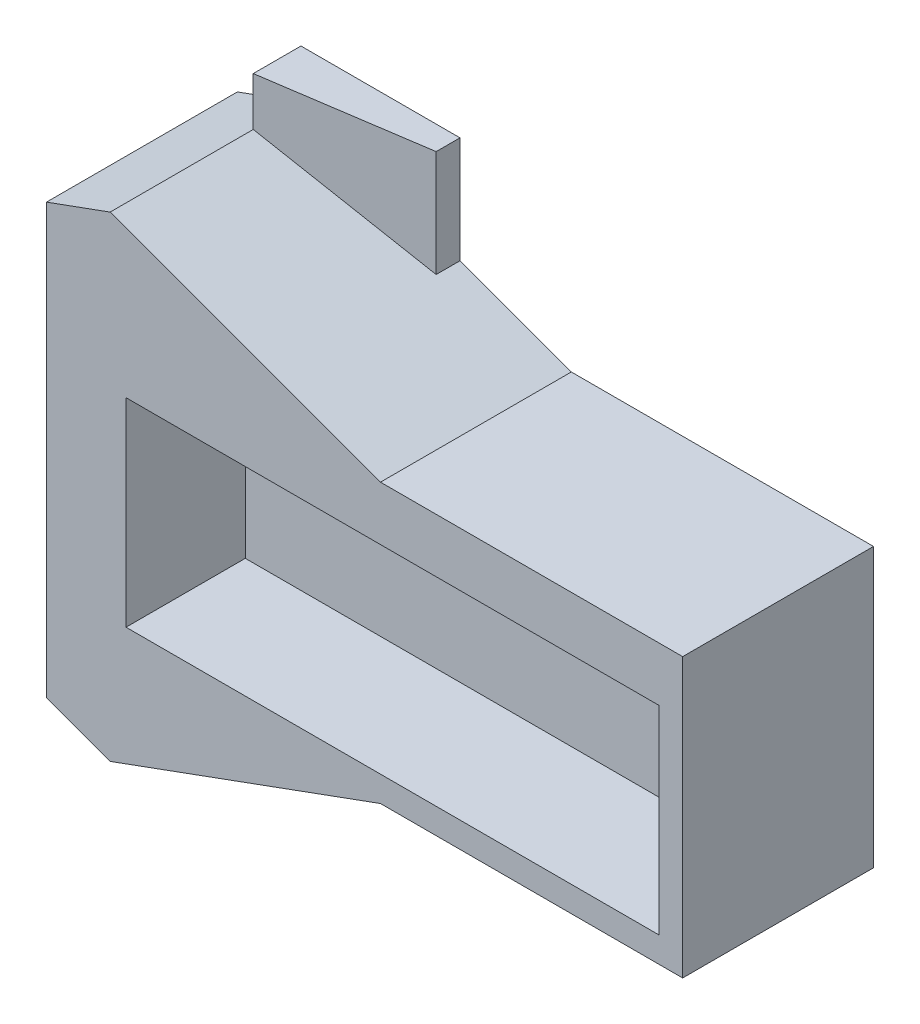
ISO-10303-21;
HEADER;
FILE_DESCRIPTION(('STEP AP214'),'2;1');
FILE_NAME('part.step','',(''),(''),'','','');
FILE_SCHEMA(('AUTOMOTIVE_DESIGN { 1 0 10303 214 1 1 1 1 }'));
ENDSEC;
DATA;
#1=APPLICATION_CONTEXT('core data for automotive mechanical design processes');
#2=APPLICATION_PROTOCOL_DEFINITION('international standard','automotive_design',2000,#1);
#3=PRODUCT_CONTEXT('',#1,'mechanical');
#4=PRODUCT('Part','Part','',(#3));
#5=PRODUCT_RELATED_PRODUCT_CATEGORY('part','',(#4));
#6=PRODUCT_DEFINITION_FORMATION('','',#4);
#7=PRODUCT_DEFINITION_CONTEXT('part definition',#1,'design');
#8=PRODUCT_DEFINITION('design','',#6,#7);
#9=PRODUCT_DEFINITION_SHAPE('','',#8);
#10=(LENGTH_UNIT() NAMED_UNIT(*) SI_UNIT(.MILLI.,.METRE.));
#11=(NAMED_UNIT(*) PLANE_ANGLE_UNIT() SI_UNIT($,.RADIAN.));
#12=(NAMED_UNIT(*) SI_UNIT($,.STERADIAN.) SOLID_ANGLE_UNIT());
#13=UNCERTAINTY_MEASURE_WITH_UNIT(LENGTH_MEASURE(1.E-05),#10,'distance_accuracy_value','');
#14=(GEOMETRIC_REPRESENTATION_CONTEXT(3) GLOBAL_UNCERTAINTY_ASSIGNED_CONTEXT((#13)) GLOBAL_UNIT_ASSIGNED_CONTEXT((#10,
#11,#12)) REPRESENTATION_CONTEXT('',''));
#15=CARTESIAN_POINT('',(0.,0.,0.));
#16=DIRECTION('',(0.,0.,1.));
#17=DIRECTION('',(1.,0.,0.));
#18=AXIS2_PLACEMENT_3D('',#15,#16,#17);
#19=CARTESIAN_POINT('',(8.,-29.9117618741296,24.));
#20=DIRECTION('',(-0.342917141847565,0.939365655017841,0.));
#21=DIRECTION('',(-0.939365655017841,-0.342917141847565,0.));
#22=AXIS2_PLACEMENT_3D('',#19,#20,#21);
#23=PLANE('',#22);
#24=DIRECTION('',(-0.930177088777126,-0.339562839019788,0.139526563316569));
#25=VECTOR('',#24,1.);
#26=CARTESIAN_POINT('',(5.6638805754881,-30.7645665213817,6.35041791367679));
#27=LINE('',#26,#25);
#28=CARTESIAN_POINT('',(28.,-22.6107254775828,3.));
#29=VERTEX_POINT('',#28);
#30=CARTESIAN_POINT('',(8.,-29.9117618741296,6.));
#31=VERTEX_POINT('',#30);
#32=EDGE_CURVE('E289',#29,#31,#27,.T.);
#33=ORIENTED_EDGE('',*,*,#32,.F.);
#34=DIRECTION('',(0.,0.,1.));
#35=VECTOR('',#34,1.);
#36=CARTESIAN_POINT('',(28.,-22.6107254775828,24.));
#37=LINE('',#36,#35);
#38=CARTESIAN_POINT('',(28.,-22.6107254775828,0.));
#39=VERTEX_POINT('',#38);
#40=EDGE_CURVE('E279',#39,#29,#37,.T.);
#41=ORIENTED_EDGE('',*,*,#40,.F.);
#42=DIRECTION('',(0.939365655017841,0.342917141847565,0.));
#43=VECTOR('',#42,1.);
#44=CARTESIAN_POINT('',(8.,-29.9117618741296,0.));
#45=LINE('',#44,#43);
#46=CARTESIAN_POINT('',(42.,-17.5,0.));
#47=VERTEX_POINT('',#46);
#48=EDGE_CURVE('E330',#39,#47,#45,.T.);
#49=ORIENTED_EDGE('',*,*,#48,.T.);
#50=DIRECTION('',(0.,0.,-1.));
#51=VECTOR('',#50,1.);
#52=CARTESIAN_POINT('',(42.,-17.5,24.));
#53=LINE('',#52,#51);
#54=CARTESIAN_POINT('',(42.,-17.5,24.));
#55=VERTEX_POINT('',#54);
#56=EDGE_CURVE('E359',#55,#47,#53,.T.);
#57=ORIENTED_EDGE('',*,*,#56,.F.);
#58=DIRECTION('',(0.939365655017841,0.342917141847565,0.));
#59=VECTOR('',#58,1.);
#60=CARTESIAN_POINT('',(8.,-29.9117618741296,24.));
#61=LINE('',#60,#59);
#62=CARTESIAN_POINT('',(8.,-29.9117618741296,24.));
#63=VERTEX_POINT('',#62);
#64=EDGE_CURVE('E305',#63,#55,#61,.T.);
#65=ORIENTED_EDGE('',*,*,#64,.F.);
#66=DIRECTION('',(0.,0.,-1.));
#67=VECTOR('',#66,1.);
#68=CARTESIAN_POINT('',(8.,-29.9117618741296,24.));
#69=LINE('',#68,#67);
#70=EDGE_CURVE('E363',#63,#31,#69,.T.);
#71=ORIENTED_EDGE('',*,*,#70,.T.);
#72=EDGE_LOOP('',(#33,#41,#49,#57,#65,#71));
#73=FACE_BOUND('',#72,.T.);
#74=ADVANCED_FACE('F43',(#73),#23,.F.);
#75=CARTESIAN_POINT('',(8.,29.9117618741296,24.));
#76=DIRECTION('',(-0.342917141847565,-0.939365655017841,0.));
#77=DIRECTION('',(0.939365655017841,-0.342917141847565,0.));
#78=AXIS2_PLACEMENT_3D('',#75,#76,#77);
#79=PLANE('',#78);
#80=DIRECTION('',(0.930177088777126,-0.339562839019788,-0.139526563316569));
#81=VECTOR('',#80,1.);
#82=CARTESIAN_POINT('',(5.6638805754881,30.7645665213817,6.35041791367679));
#83=LINE('',#82,#81);
#84=CARTESIAN_POINT('',(8.,29.9117618741296,6.));
#85=VERTEX_POINT('',#84);
#86=CARTESIAN_POINT('',(28.,22.6107254775828,3.));
#87=VERTEX_POINT('',#86);
#88=EDGE_CURVE('E11',#85,#87,#83,.T.);
#89=ORIENTED_EDGE('',*,*,#88,.F.);
#90=DIRECTION('',(0.,0.,-1.));
#91=VECTOR('',#90,1.);
#92=CARTESIAN_POINT('',(8.,29.9117618741296,24.));
#93=LINE('',#92,#91);
#94=CARTESIAN_POINT('',(8.,29.9117618741296,24.));
#95=VERTEX_POINT('',#94);
#96=EDGE_CURVE('E320',#95,#85,#93,.T.);
#97=ORIENTED_EDGE('',*,*,#96,.F.);
#98=DIRECTION('',(-0.939365655017841,0.342917141847565,0.));
#99=VECTOR('',#98,1.);
#100=CARTESIAN_POINT('',(8.,29.9117618741296,24.));
#101=LINE('',#100,#99);
#102=CARTESIAN_POINT('',(42.,17.5,24.));
#103=VERTEX_POINT('',#102);
#104=EDGE_CURVE('E317',#103,#95,#101,.T.);
#105=ORIENTED_EDGE('',*,*,#104,.F.);
#106=DIRECTION('',(0.,0.,-1.));
#107=VECTOR('',#106,1.);
#108=CARTESIAN_POINT('',(42.,17.5,24.));
#109=LINE('',#108,#107);
#110=CARTESIAN_POINT('',(42.,17.5,0.));
#111=VERTEX_POINT('',#110);
#112=EDGE_CURVE('E347',#103,#111,#109,.T.);
#113=ORIENTED_EDGE('',*,*,#112,.T.);
#114=DIRECTION('',(-0.939365655017841,0.342917141847565,0.));
#115=VECTOR('',#114,1.);
#116=CARTESIAN_POINT('',(8.,29.9117618741296,0.));
#117=LINE('',#116,#115);
#118=CARTESIAN_POINT('',(28.,22.6107254775828,0.));
#119=VERTEX_POINT('',#118);
#120=EDGE_CURVE('E299',#111,#119,#117,.T.);
#121=ORIENTED_EDGE('',*,*,#120,.T.);
#122=DIRECTION('',(0.,0.,-1.));
#123=VECTOR('',#122,1.);
#124=CARTESIAN_POINT('',(28.,22.6107254775828,24.));
#125=LINE('',#124,#123);
#126=EDGE_CURVE('E275',#87,#119,#125,.T.);
#127=ORIENTED_EDGE('',*,*,#126,.F.);
#128=EDGE_LOOP('',(#89,#97,#105,#113,#121,#127));
#129=FACE_BOUND('',#128,.T.);
#130=ADVANCED_FACE('F398',(#129),#79,.F.);
#131=CARTESIAN_POINT('',(0.,27.,24.));
#132=DIRECTION('',(0.342020143325666,-0.939692620785909,0.));
#133=DIRECTION('',(0.93969262078591,0.342020143325666,0.));
#134=AXIS2_PLACEMENT_3D('',#131,#132,#133);
#135=PLANE('',#134);
#136=DIRECTION('',(-0.93969262078591,-0.342020143325666,0.));
#137=VECTOR('',#136,1.);
#138=CARTESIAN_POINT('',(0.,27.,0.));
#139=LINE('',#138,#137);
#140=CARTESIAN_POINT('',(8.,29.9117618741296,0.));
#141=VERTEX_POINT('',#140);
#142=CARTESIAN_POINT('',(0.,27.,0.));
#143=VERTEX_POINT('',#142);
#144=EDGE_CURVE('E293',#141,#143,#139,.T.);
#145=ORIENTED_EDGE('',*,*,#144,.T.);
#146=DIRECTION('',(0.,0.,-1.));
#147=VECTOR('',#146,1.);
#148=CARTESIAN_POINT('',(0.,27.,24.));
#149=LINE('',#148,#147);
#150=CARTESIAN_POINT('',(0.,27.,24.));
#151=VERTEX_POINT('',#150);
#152=EDGE_CURVE('E52',#151,#143,#149,.T.);
#153=ORIENTED_EDGE('',*,*,#152,.F.);
#154=DIRECTION('',(-0.93969262078591,-0.342020143325666,0.));
#155=VECTOR('',#154,1.);
#156=CARTESIAN_POINT('',(0.,27.,24.));
#157=LINE('',#156,#155);
#158=EDGE_CURVE('E294',#95,#151,#157,.T.);
#159=ORIENTED_EDGE('',*,*,#158,.F.);
#160=ORIENTED_EDGE('',*,*,#96,.T.);
#161=DIRECTION('',(0.,0.,1.));
#162=VECTOR('',#161,1.);
#163=CARTESIAN_POINT('',(8.,29.9117618741296,24.));
#164=LINE('',#163,#162);
#165=EDGE_CURVE('E283',#141,#85,#164,.T.);
#166=ORIENTED_EDGE('',*,*,#165,.F.);
#167=EDGE_LOOP('',(#145,#153,#159,#160,#166));
#168=FACE_BOUND('',#167,.T.);
#169=ADVANCED_FACE('F45',(#168),#135,.F.);
#170=CARTESIAN_POINT('',(0.,-27.,24.));
#171=DIRECTION('',(1.,0.,0.));
#172=DIRECTION('',(0.,0.,-1.));
#173=AXIS2_PLACEMENT_3D('',#170,#171,#172);
#174=PLANE('',#173);
#175=DIRECTION('',(0.,-1.,0.));
#176=VECTOR('',#175,1.);
#177=CARTESIAN_POINT('',(0.,-27.,0.));
#178=LINE('',#177,#176);
#179=CARTESIAN_POINT('',(0.,-27.,0.));
#180=VERTEX_POINT('',#179);
#181=EDGE_CURVE('E324',#143,#180,#178,.T.);
#182=ORIENTED_EDGE('',*,*,#181,.T.);
#183=DIRECTION('',(0.,0.,-1.));
#184=VECTOR('',#183,1.);
#185=CARTESIAN_POINT('',(0.,-27.,24.));
#186=LINE('',#185,#184);
#187=CARTESIAN_POINT('',(0.,-27.,24.));
#188=VERTEX_POINT('',#187);
#189=EDGE_CURVE('E366',#188,#180,#186,.T.);
#190=ORIENTED_EDGE('',*,*,#189,.F.);
#191=DIRECTION('',(0.,-1.,0.));
#192=VECTOR('',#191,1.);
#193=CARTESIAN_POINT('',(0.,-27.,24.));
#194=LINE('',#193,#192);
#195=EDGE_CURVE('E298',#151,#188,#194,.T.);
#196=ORIENTED_EDGE('',*,*,#195,.F.);
#197=ORIENTED_EDGE('',*,*,#152,.T.);
#198=EDGE_LOOP('',(#182,#190,#196,#197));
#199=FACE_BOUND('',#198,.T.);
#200=ADVANCED_FACE('F373',(#199),#174,.F.);
#201=CARTESIAN_POINT('',(0.,-27.,24.));
#202=DIRECTION('',(0.342020143325666,0.939692620785909,0.));
#203=DIRECTION('',(-0.93969262078591,0.342020143325666,0.));
#204=AXIS2_PLACEMENT_3D('',#201,#202,#203);
#205=PLANE('',#204);
#206=DIRECTION('',(0.93969262078591,-0.342020143325666,0.));
#207=VECTOR('',#206,1.);
#208=CARTESIAN_POINT('',(0.,-27.,0.));
#209=LINE('',#208,#207);
#210=CARTESIAN_POINT('',(8.,-29.9117618741296,0.));
#211=VERTEX_POINT('',#210);
#212=EDGE_CURVE('E327',#180,#211,#209,.T.);
#213=ORIENTED_EDGE('',*,*,#212,.T.);
#214=DIRECTION('',(0.,0.,-1.));
#215=VECTOR('',#214,1.);
#216=CARTESIAN_POINT('',(8.,-29.9117618741296,24.));
#217=LINE('',#216,#215);
#218=EDGE_CURVE('E67',#31,#211,#217,.T.);
#219=ORIENTED_EDGE('',*,*,#218,.F.);
#220=ORIENTED_EDGE('',*,*,#70,.F.);
#221=DIRECTION('',(0.93969262078591,-0.342020143325666,0.));
#222=VECTOR('',#221,1.);
#223=CARTESIAN_POINT('',(0.,-27.,24.));
#224=LINE('',#223,#222);
#225=EDGE_CURVE('E302',#188,#63,#224,.T.);
#226=ORIENTED_EDGE('',*,*,#225,.F.);
#227=ORIENTED_EDGE('',*,*,#189,.T.);
#228=EDGE_LOOP('',(#213,#219,#220,#226,#227));
#229=FACE_BOUND('',#228,.T.);
#230=ADVANCED_FACE('F426',(#229),#205,.F.);
#231=CARTESIAN_POINT('',(42.,-17.5,24.));
#232=DIRECTION('',(0.,1.,0.));
#233=DIRECTION('',(0.,0.,1.));
#234=AXIS2_PLACEMENT_3D('',#231,#232,#233);
#235=PLANE('',#234);
#236=DIRECTION('',(1.,0.,0.));
#237=VECTOR('',#236,1.);
#238=CARTESIAN_POINT('',(42.,-17.5,0.));
#239=LINE('',#238,#237);
#240=CARTESIAN_POINT('',(80.,-17.5,0.));
#241=VERTEX_POINT('',#240);
#242=EDGE_CURVE('E333',#47,#241,#239,.T.);
#243=ORIENTED_EDGE('',*,*,#242,.T.);
#244=DIRECTION('',(0.,0.,-1.));
#245=VECTOR('',#244,1.);
#246=CARTESIAN_POINT('',(80.,-17.5,24.));
#247=LINE('',#246,#245);
#248=CARTESIAN_POINT('',(80.,-17.5,24.));
#249=VERTEX_POINT('',#248);
#250=EDGE_CURVE('E355',#249,#241,#247,.T.);
#251=ORIENTED_EDGE('',*,*,#250,.F.);
#252=DIRECTION('',(1.,0.,0.));
#253=VECTOR('',#252,1.);
#254=CARTESIAN_POINT('',(42.,-17.5,24.));
#255=LINE('',#254,#253);
#256=EDGE_CURVE('E308',#55,#249,#255,.T.);
#257=ORIENTED_EDGE('',*,*,#256,.F.);
#258=ORIENTED_EDGE('',*,*,#56,.T.);
#259=EDGE_LOOP('',(#243,#251,#257,#258));
#260=FACE_BOUND('',#259,.T.);
#261=ADVANCED_FACE('F424',(#260),#235,.F.);
#262=CARTESIAN_POINT('',(80.,17.5,24.));
#263=DIRECTION('',(-1.,0.,0.));
#264=DIRECTION('',(0.,0.,1.));
#265=AXIS2_PLACEMENT_3D('',#262,#263,#264);
#266=PLANE('',#265);
#267=DIRECTION('',(0.,1.,0.));
#268=VECTOR('',#267,1.);
#269=CARTESIAN_POINT('',(80.,17.5,0.));
#270=LINE('',#269,#268);
#271=CARTESIAN_POINT('',(80.,17.5,0.));
#272=VERTEX_POINT('',#271);
#273=EDGE_CURVE('E336',#241,#272,#270,.T.);
#274=ORIENTED_EDGE('',*,*,#273,.T.);
#275=DIRECTION('',(0.,0.,-1.));
#276=VECTOR('',#275,1.);
#277=CARTESIAN_POINT('',(80.,17.5,24.));
#278=LINE('',#277,#276);
#279=CARTESIAN_POINT('',(80.,17.5,24.));
#280=VERTEX_POINT('',#279);
#281=EDGE_CURVE('E351',#280,#272,#278,.T.);
#282=ORIENTED_EDGE('',*,*,#281,.F.);
#283=DIRECTION('',(0.,1.,0.));
#284=VECTOR('',#283,1.);
#285=CARTESIAN_POINT('',(80.,17.5,24.));
#286=LINE('',#285,#284);
#287=EDGE_CURVE('E311',#249,#280,#286,.T.);
#288=ORIENTED_EDGE('',*,*,#287,.F.);
#289=ORIENTED_EDGE('',*,*,#250,.T.);
#290=EDGE_LOOP('',(#274,#282,#288,#289));
#291=FACE_BOUND('',#290,.T.);
#292=ADVANCED_FACE('F456',(#291),#266,.F.);
#293=CARTESIAN_POINT('',(42.,17.5,24.));
#294=DIRECTION('',(0.,-1.,0.));
#295=DIRECTION('',(0.,0.,-1.));
#296=AXIS2_PLACEMENT_3D('',#293,#294,#295);
#297=PLANE('',#296);
#298=DIRECTION('',(-1.,0.,0.));
#299=VECTOR('',#298,1.);
#300=CARTESIAN_POINT('',(42.,17.5,0.));
#301=LINE('',#300,#299);
#302=EDGE_CURVE('E339',#272,#111,#301,.T.);
#303=ORIENTED_EDGE('',*,*,#302,.T.);
#304=ORIENTED_EDGE('',*,*,#112,.F.);
#305=DIRECTION('',(-1.,0.,0.));
#306=VECTOR('',#305,1.);
#307=CARTESIAN_POINT('',(42.,17.5,24.));
#308=LINE('',#307,#306);
#309=EDGE_CURVE('E314',#280,#103,#308,.T.);
#310=ORIENTED_EDGE('',*,*,#309,.F.);
#311=ORIENTED_EDGE('',*,*,#281,.T.);
#312=EDGE_LOOP('',(#303,#304,#310,#311));
#313=FACE_BOUND('',#312,.T.);
#314=ADVANCED_FACE('F450',(#313),#297,.F.);
#315=CARTESIAN_POINT('',(0.,0.,24.));
#316=DIRECTION('',(0.,0.,-1.));
#317=DIRECTION('',(-1.,0.,0.));
#318=AXIS2_PLACEMENT_3D('',#315,#316,#317);
#319=PLANE('',#318);
#320=DIRECTION('',(-1.,0.,0.));
#321=VECTOR('',#320,1.);
#322=CARTESIAN_POINT('',(9.99999999999999,10.7021672824616,24.));
#323=LINE('',#322,#321);
#324=CARTESIAN_POINT('',(77.,10.7021672824616,24.));
#325=VERTEX_POINT('',#324);
#326=CARTESIAN_POINT('',(9.99999999999999,10.7021672824616,24.));
#327=VERTEX_POINT('',#326);
#328=EDGE_CURVE('E212',#325,#327,#323,.T.);
#329=ORIENTED_EDGE('',*,*,#328,.F.);
#330=DIRECTION('',(0.,1.,0.));
#331=VECTOR('',#330,1.);
#332=CARTESIAN_POINT('',(77.,-14.2978327175384,24.));
#333=LINE('',#332,#331);
#334=CARTESIAN_POINT('',(77.,-14.2978327175384,24.));
#335=VERTEX_POINT('',#334);
#336=EDGE_CURVE('E59',#335,#325,#333,.T.);
#337=ORIENTED_EDGE('',*,*,#336,.F.);
#338=DIRECTION('',(1.,0.,0.));
#339=VECTOR('',#338,1.);
#340=CARTESIAN_POINT('',(9.99999999999999,-14.2978327175384,24.));
#341=LINE('',#340,#339);
#342=CARTESIAN_POINT('',(9.99999999999999,-14.2978327175384,24.));
#343=VERTEX_POINT('',#342);
#344=EDGE_CURVE('E199',#343,#335,#341,.T.);
#345=ORIENTED_EDGE('',*,*,#344,.F.);
#346=DIRECTION('',(0.,-1.,0.));
#347=VECTOR('',#346,1.);
#348=CARTESIAN_POINT('',(9.99999999999999,-14.2978327175384,24.));
#349=LINE('',#348,#347);
#350=EDGE_CURVE('E203',#327,#343,#349,.T.);
#351=ORIENTED_EDGE('',*,*,#350,.F.);
#352=EDGE_LOOP('',(#329,#337,#345,#351));
#353=FACE_BOUND('',#352,.T.);
#354=ORIENTED_EDGE('',*,*,#158,.T.);
#355=ORIENTED_EDGE('',*,*,#195,.T.);
#356=ORIENTED_EDGE('',*,*,#225,.T.);
#357=ORIENTED_EDGE('',*,*,#64,.T.);
#358=ORIENTED_EDGE('',*,*,#256,.T.);
#359=ORIENTED_EDGE('',*,*,#287,.T.);
#360=ORIENTED_EDGE('',*,*,#309,.T.);
#361=ORIENTED_EDGE('',*,*,#104,.T.);
#362=EDGE_LOOP('',(#354,#355,#356,#357,#358,#359,#360,#361));
#363=FACE_BOUND('',#362,.T.);
#364=ADVANCED_FACE('F455',(#353,#363),#319,.F.);
#365=CARTESIAN_POINT('',(0.,0.,0.));
#366=DIRECTION('',(0.,0.,-1.));
#367=DIRECTION('',(-1.,0.,0.));
#368=AXIS2_PLACEMENT_3D('',#365,#366,#367);
#369=PLANE('',#368);
#370=ORIENTED_EDGE('',*,*,#48,.F.);
#371=DIRECTION('',(0.,-1.,0.));
#372=VECTOR('',#371,1.);
#373=CARTESIAN_POINT('',(28.,36.,0.));
#374=LINE('',#373,#372);
#375=CARTESIAN_POINT('',(28.,-36.,0.));
#376=VERTEX_POINT('',#375);
#377=EDGE_CURVE('E241',#39,#376,#374,.T.);
#378=ORIENTED_EDGE('',*,*,#377,.T.);
#379=DIRECTION('',(-1.,0.,0.));
#380=VECTOR('',#379,1.);
#381=CARTESIAN_POINT('',(28.,-36.,0.));
#382=LINE('',#381,#380);
#383=CARTESIAN_POINT('',(8.,-36.,0.));
#384=VERTEX_POINT('',#383);
#385=EDGE_CURVE('E221',#376,#384,#382,.T.);
#386=ORIENTED_EDGE('',*,*,#385,.T.);
#387=DIRECTION('',(0.,-1.,0.));
#388=VECTOR('',#387,1.);
#389=CARTESIAN_POINT('',(8.,36.,0.));
#390=LINE('',#389,#388);
#391=EDGE_CURVE('E270',#211,#384,#390,.T.);
#392=ORIENTED_EDGE('',*,*,#391,.F.);
#393=ORIENTED_EDGE('',*,*,#212,.F.);
#394=ORIENTED_EDGE('',*,*,#181,.F.);
#395=ORIENTED_EDGE('',*,*,#144,.F.);
#396=CARTESIAN_POINT('',(8.,36.,0.));
#397=VERTEX_POINT('',#396);
#398=EDGE_CURVE('E271',#397,#141,#390,.T.);
#399=ORIENTED_EDGE('',*,*,#398,.F.);
#400=DIRECTION('',(-1.,0.,0.));
#401=VECTOR('',#400,1.);
#402=CARTESIAN_POINT('',(28.,36.,0.));
#403=LINE('',#402,#401);
#404=CARTESIAN_POINT('',(28.,36.,0.));
#405=VERTEX_POINT('',#404);
#406=EDGE_CURVE('E227',#405,#397,#403,.T.);
#407=ORIENTED_EDGE('',*,*,#406,.F.);
#408=EDGE_CURVE('E256',#405,#119,#374,.T.);
#409=ORIENTED_EDGE('',*,*,#408,.T.);
#410=ORIENTED_EDGE('',*,*,#120,.F.);
#411=ORIENTED_EDGE('',*,*,#302,.F.);
#412=ORIENTED_EDGE('',*,*,#273,.F.);
#413=ORIENTED_EDGE('',*,*,#242,.F.);
#414=EDGE_LOOP('',(#370,#378,#386,#392,#393,#394,#395,#399,#407,#409,#410,#411,#412,#413));
#415=FACE_BOUND('',#414,.T.);
#416=ADVANCED_FACE('F381',(#415),#369,.T.);
#417=CARTESIAN_POINT('',(0.,36.,0.));
#418=DIRECTION('',(0.,1.,0.));
#419=DIRECTION('',(0.,0.,1.));
#420=AXIS2_PLACEMENT_3D('',#417,#418,#419);
#421=PLANE('',#420);
#422=ORIENTED_EDGE('',*,*,#406,.T.);
#423=DIRECTION('',(0.,0.,1.));
#424=VECTOR('',#423,1.);
#425=CARTESIAN_POINT('',(8.,36.,0.));
#426=LINE('',#425,#424);
#427=CARTESIAN_POINT('',(8.,36.,6.));
#428=VERTEX_POINT('',#427);
#429=EDGE_CURVE('E231',#397,#428,#426,.T.);
#430=ORIENTED_EDGE('',*,*,#429,.T.);
#431=DIRECTION('',(0.988936352868298,0.,-0.148340452930245));
#432=VECTOR('',#431,1.);
#433=CARTESIAN_POINT('',(8.,36.,6.));
#434=LINE('',#433,#432);
#435=CARTESIAN_POINT('',(28.,36.,3.));
#436=VERTEX_POINT('',#435);
#437=EDGE_CURVE('E235',#428,#436,#434,.T.);
#438=ORIENTED_EDGE('',*,*,#437,.T.);
#439=DIRECTION('',(0.,0.,-1.));
#440=VECTOR('',#439,1.);
#441=CARTESIAN_POINT('',(28.,36.,3.));
#442=LINE('',#441,#440);
#443=EDGE_CURVE('E238',#436,#405,#442,.T.);
#444=ORIENTED_EDGE('',*,*,#443,.T.);
#445=EDGE_LOOP('',(#422,#430,#438,#444));
#446=FACE_BOUND('',#445,.T.);
#447=ADVANCED_FACE('F389',(#446),#421,.T.);
#448=CARTESIAN_POINT('',(28.,36.,3.));
#449=DIRECTION('',(-1.,0.,0.));
#450=DIRECTION('',(0.,0.,1.));
#451=AXIS2_PLACEMENT_3D('',#448,#449,#450);
#452=PLANE('',#451);
#453=DIRECTION('',(0.,-1.,0.));
#454=VECTOR('',#453,1.);
#455=CARTESIAN_POINT('',(28.,36.,3.));
#456=LINE('',#455,#454);
#457=EDGE_CURVE('E261',#436,#87,#456,.T.);
#458=ORIENTED_EDGE('',*,*,#457,.T.);
#459=ORIENTED_EDGE('',*,*,#126,.T.);
#460=ORIENTED_EDGE('',*,*,#408,.F.);
#461=ORIENTED_EDGE('',*,*,#443,.F.);
#462=EDGE_LOOP('',(#458,#459,#460,#461));
#463=FACE_BOUND('',#462,.T.);
#464=ADVANCED_FACE('F395',(#463),#452,.F.);
#465=CARTESIAN_POINT('',(8.,36.,6.));
#466=DIRECTION('',(-0.148340452930245,0.,-0.988936352868297));
#467=DIRECTION('',(-0.988936352868298,0.,0.148340452930245));
#468=AXIS2_PLACEMENT_3D('',#465,#466,#467);
#469=PLANE('',#468);
#470=DIRECTION('',(0.,-1.,0.));
#471=VECTOR('',#470,1.);
#472=CARTESIAN_POINT('',(8.,36.,6.));
#473=LINE('',#472,#471);
#474=EDGE_CURVE('E266',#428,#85,#473,.T.);
#475=ORIENTED_EDGE('',*,*,#474,.T.);
#476=ORIENTED_EDGE('',*,*,#88,.T.);
#477=ORIENTED_EDGE('',*,*,#457,.F.);
#478=ORIENTED_EDGE('',*,*,#437,.F.);
#479=EDGE_LOOP('',(#475,#476,#477,#478));
#480=FACE_BOUND('',#479,.T.);
#481=ADVANCED_FACE('F401',(#480),#469,.F.);
#482=CARTESIAN_POINT('',(8.,36.,0.));
#483=DIRECTION('',(1.,0.,0.));
#484=DIRECTION('',(0.,0.,-1.));
#485=AXIS2_PLACEMENT_3D('',#482,#483,#484);
#486=PLANE('',#485);
#487=ORIENTED_EDGE('',*,*,#398,.T.);
#488=ORIENTED_EDGE('',*,*,#165,.T.);
#489=ORIENTED_EDGE('',*,*,#474,.F.);
#490=ORIENTED_EDGE('',*,*,#429,.F.);
#491=EDGE_LOOP('',(#487,#488,#489,#490));
#492=FACE_BOUND('',#491,.T.);
#493=ADVANCED_FACE('F385',(#492),#486,.F.);
#494=CARTESIAN_POINT('',(28.,-36.,3.));
#495=VERTEX_POINT('',#494);
#496=EDGE_CURVE('E260',#29,#495,#456,.T.);
#497=ORIENTED_EDGE('',*,*,#496,.F.);
#498=ORIENTED_EDGE('',*,*,#32,.T.);
#499=CARTESIAN_POINT('',(8.,-36.,6.));
#500=VERTEX_POINT('',#499);
#501=EDGE_CURVE('E265',#31,#500,#473,.T.);
#502=ORIENTED_EDGE('',*,*,#501,.T.);
#503=DIRECTION('',(0.988936352868298,0.,-0.148340452930245));
#504=VECTOR('',#503,1.);
#505=CARTESIAN_POINT('',(8.,-36.,6.));
#506=LINE('',#505,#504);
#507=EDGE_CURVE('E249',#500,#495,#506,.T.);
#508=ORIENTED_EDGE('',*,*,#507,.T.);
#509=EDGE_LOOP('',(#497,#498,#502,#508));
#510=FACE_BOUND('',#509,.T.);
#511=ADVANCED_FACE('F404',(#510),#469,.F.);
#512=ORIENTED_EDGE('',*,*,#501,.F.);
#513=ORIENTED_EDGE('',*,*,#218,.T.);
#514=ORIENTED_EDGE('',*,*,#391,.T.);
#515=DIRECTION('',(0.,0.,1.));
#516=VECTOR('',#515,1.);
#517=CARTESIAN_POINT('',(8.,-36.,0.));
#518=LINE('',#517,#516);
#519=EDGE_CURVE('E245',#384,#500,#518,.T.);
#520=ORIENTED_EDGE('',*,*,#519,.T.);
#521=EDGE_LOOP('',(#512,#513,#514,#520));
#522=FACE_BOUND('',#521,.T.);
#523=ADVANCED_FACE('F410',(#522),#486,.F.);
#524=ORIENTED_EDGE('',*,*,#377,.F.);
#525=ORIENTED_EDGE('',*,*,#40,.T.);
#526=ORIENTED_EDGE('',*,*,#496,.T.);
#527=DIRECTION('',(0.,0.,-1.));
#528=VECTOR('',#527,1.);
#529=CARTESIAN_POINT('',(28.,-36.,3.));
#530=LINE('',#529,#528);
#531=EDGE_CURVE('E232',#495,#376,#530,.T.);
#532=ORIENTED_EDGE('',*,*,#531,.T.);
#533=EDGE_LOOP('',(#524,#525,#526,#532));
#534=FACE_BOUND('',#533,.T.);
#535=ADVANCED_FACE('F412',(#534),#452,.F.);
#536=CARTESIAN_POINT('',(0.,-36.,0.));
#537=DIRECTION('',(0.,1.,0.));
#538=DIRECTION('',(0.,0.,1.));
#539=AXIS2_PLACEMENT_3D('',#536,#537,#538);
#540=PLANE('',#539);
#541=ORIENTED_EDGE('',*,*,#385,.F.);
#542=ORIENTED_EDGE('',*,*,#531,.F.);
#543=ORIENTED_EDGE('',*,*,#507,.F.);
#544=ORIENTED_EDGE('',*,*,#519,.F.);
#545=EDGE_LOOP('',(#541,#542,#543,#544));
#546=FACE_BOUND('',#545,.T.);
#547=ADVANCED_FACE('F555',(#546),#540,.F.);
#548=CARTESIAN_POINT('',(77.,-14.2978327175384,9.));
#549=DIRECTION('',(1.,0.,0.));
#550=DIRECTION('',(0.,0.,-1.));
#551=AXIS2_PLACEMENT_3D('',#548,#549,#550);
#552=PLANE('',#551);
#553=ORIENTED_EDGE('',*,*,#336,.T.);
#554=DIRECTION('',(0.,0.,1.));
#555=VECTOR('',#554,1.);
#556=CARTESIAN_POINT('',(77.,10.7021672824616,9.));
#557=LINE('',#556,#555);
#558=CARTESIAN_POINT('',(77.,10.7021672824616,9.));
#559=VERTEX_POINT('',#558);
#560=EDGE_CURVE('E174',#559,#325,#557,.T.);
#561=ORIENTED_EDGE('',*,*,#560,.F.);
#562=DIRECTION('',(0.,1.,0.));
#563=VECTOR('',#562,1.);
#564=CARTESIAN_POINT('',(77.,-14.2978327175384,9.));
#565=LINE('',#564,#563);
#566=CARTESIAN_POINT('',(77.,-14.2978327175384,9.));
#567=VERTEX_POINT('',#566);
#568=EDGE_CURVE('E178',#567,#559,#565,.T.);
#569=ORIENTED_EDGE('',*,*,#568,.F.);
#570=DIRECTION('',(0.,0.,1.));
#571=VECTOR('',#570,1.);
#572=CARTESIAN_POINT('',(77.,-14.2978327175384,9.));
#573=LINE('',#572,#571);
#574=EDGE_CURVE('E218',#567,#335,#573,.T.);
#575=ORIENTED_EDGE('',*,*,#574,.T.);
#576=EDGE_LOOP('',(#553,#561,#569,#575));
#577=FACE_BOUND('',#576,.T.);
#578=ADVANCED_FACE('F176',(#577),#552,.F.);
#579=CARTESIAN_POINT('',(9.99999999999999,-14.2978327175384,9.));
#580=DIRECTION('',(0.,-1.,0.));
#581=DIRECTION('',(0.,0.,-1.));
#582=AXIS2_PLACEMENT_3D('',#579,#580,#581);
#583=PLANE('',#582);
#584=ORIENTED_EDGE('',*,*,#344,.T.);
#585=ORIENTED_EDGE('',*,*,#574,.F.);
#586=DIRECTION('',(1.,0.,0.));
#587=VECTOR('',#586,1.);
#588=CARTESIAN_POINT('',(9.99999999999999,-14.2978327175384,9.));
#589=LINE('',#588,#587);
#590=CARTESIAN_POINT('',(9.99999999999999,-14.2978327175384,9.));
#591=VERTEX_POINT('',#590);
#592=EDGE_CURVE('E185',#591,#567,#589,.T.);
#593=ORIENTED_EDGE('',*,*,#592,.F.);
#594=DIRECTION('',(0.,0.,1.));
#595=VECTOR('',#594,1.);
#596=CARTESIAN_POINT('',(9.99999999999999,-14.2978327175384,9.));
#597=LINE('',#596,#595);
#598=EDGE_CURVE('E222',#591,#343,#597,.T.);
#599=ORIENTED_EDGE('',*,*,#598,.T.);
#600=EDGE_LOOP('',(#584,#585,#593,#599));
#601=FACE_BOUND('',#600,.T.);
#602=ADVANCED_FACE('F583',(#601),#583,.F.);
#603=CARTESIAN_POINT('',(9.99999999999999,-14.2978327175384,9.));
#604=DIRECTION('',(-1.,0.,0.));
#605=DIRECTION('',(0.,0.,1.));
#606=AXIS2_PLACEMENT_3D('',#603,#604,#605);
#607=PLANE('',#606);
#608=ORIENTED_EDGE('',*,*,#350,.T.);
#609=ORIENTED_EDGE('',*,*,#598,.F.);
#610=DIRECTION('',(0.,-1.,0.));
#611=VECTOR('',#610,1.);
#612=CARTESIAN_POINT('',(9.99999999999999,-14.2978327175384,9.));
#613=LINE('',#612,#611);
#614=CARTESIAN_POINT('',(9.99999999999999,10.7021672824616,9.));
#615=VERTEX_POINT('',#614);
#616=EDGE_CURVE('E194',#615,#591,#613,.T.);
#617=ORIENTED_EDGE('',*,*,#616,.F.);
#618=DIRECTION('',(0.,0.,1.));
#619=VECTOR('',#618,1.);
#620=CARTESIAN_POINT('',(9.99999999999999,10.7021672824616,9.));
#621=LINE('',#620,#619);
#622=EDGE_CURVE('E184',#615,#327,#621,.T.);
#623=ORIENTED_EDGE('',*,*,#622,.T.);
#624=EDGE_LOOP('',(#608,#609,#617,#623));
#625=FACE_BOUND('',#624,.T.);
#626=ADVANCED_FACE('F593',(#625),#607,.F.);
#627=CARTESIAN_POINT('',(9.99999999999999,10.7021672824616,9.));
#628=DIRECTION('',(0.,1.,0.));
#629=DIRECTION('',(0.,0.,1.));
#630=AXIS2_PLACEMENT_3D('',#627,#628,#629);
#631=PLANE('',#630);
#632=ORIENTED_EDGE('',*,*,#328,.T.);
#633=ORIENTED_EDGE('',*,*,#622,.F.);
#634=DIRECTION('',(-1.,0.,0.));
#635=VECTOR('',#634,1.);
#636=CARTESIAN_POINT('',(9.99999999999999,10.7021672824616,9.));
#637=LINE('',#636,#635);
#638=EDGE_CURVE('E188',#559,#615,#637,.T.);
#639=ORIENTED_EDGE('',*,*,#638,.F.);
#640=ORIENTED_EDGE('',*,*,#560,.T.);
#641=EDGE_LOOP('',(#632,#633,#639,#640));
#642=FACE_BOUND('',#641,.T.);
#643=ADVANCED_FACE('F189',(#642),#631,.F.);
#644=CARTESIAN_POINT('',(0.,0.,9.));
#645=DIRECTION('',(0.,0.,-1.));
#646=DIRECTION('',(-1.,0.,0.));
#647=AXIS2_PLACEMENT_3D('',#644,#645,#646);
#648=PLANE('',#647);
#649=ORIENTED_EDGE('',*,*,#568,.T.);
#650=ORIENTED_EDGE('',*,*,#638,.T.);
#651=ORIENTED_EDGE('',*,*,#616,.T.);
#652=ORIENTED_EDGE('',*,*,#592,.T.);
#653=EDGE_LOOP('',(#649,#650,#651,#652));
#654=FACE_BOUND('',#653,.T.);
#655=ADVANCED_FACE('F196',(#654),#648,.F.);
#656=CLOSED_SHELL('',(#74,#130,#169,#200,#230,#261,#292,#314,#364,#416,#447,#464,#481,#493,#511,
#523,#535,#547,#578,#602,#626,#643,#655));
#657=MANIFOLD_SOLID_BREP('B2',#656);
#658=ADVANCED_BREP_SHAPE_REPRESENTATION('',(#18,#657),#14);
#659=SHAPE_DEFINITION_REPRESENTATION(#9,#658);
ENDSEC;
END-ISO-10303-21;
